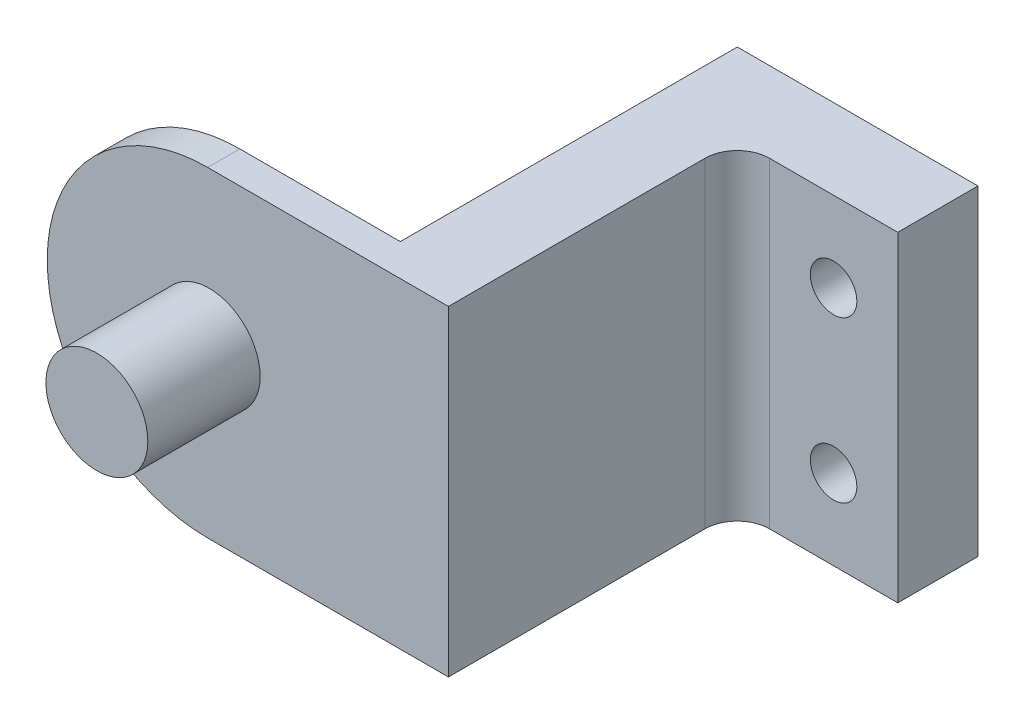
ISO-10303-21;
HEADER;
FILE_DESCRIPTION(('STEP AP214'),'2;1');
FILE_NAME('part.step','',(''),(''),'','','');
FILE_SCHEMA(('AUTOMOTIVE_DESIGN { 1 0 10303 214 1 1 1 1 }'));
ENDSEC;
DATA;
#1=APPLICATION_CONTEXT('core data for automotive mechanical design processes');
#2=APPLICATION_PROTOCOL_DEFINITION('international standard','automotive_design',2000,#1);
#3=PRODUCT_CONTEXT('',#1,'mechanical');
#4=PRODUCT('Part','Part','',(#3));
#5=PRODUCT_RELATED_PRODUCT_CATEGORY('part','',(#4));
#6=PRODUCT_DEFINITION_FORMATION('','',#4);
#7=PRODUCT_DEFINITION_CONTEXT('part definition',#1,'design');
#8=PRODUCT_DEFINITION('design','',#6,#7);
#9=PRODUCT_DEFINITION_SHAPE('','',#8);
#10=(LENGTH_UNIT() NAMED_UNIT(*) SI_UNIT(.MILLI.,.METRE.));
#11=(NAMED_UNIT(*) PLANE_ANGLE_UNIT() SI_UNIT($,.RADIAN.));
#12=(NAMED_UNIT(*) SI_UNIT($,.STERADIAN.) SOLID_ANGLE_UNIT());
#13=UNCERTAINTY_MEASURE_WITH_UNIT(LENGTH_MEASURE(1.E-05),#10,'distance_accuracy_value','');
#14=(GEOMETRIC_REPRESENTATION_CONTEXT(3) GLOBAL_UNCERTAINTY_ASSIGNED_CONTEXT((#13)) GLOBAL_UNIT_ASSIGNED_CONTEXT((#10,
#11,#12)) REPRESENTATION_CONTEXT('',''));
#15=CARTESIAN_POINT('',(0.,0.,0.));
#16=DIRECTION('',(0.,0.,1.));
#17=DIRECTION('',(1.,0.,0.));
#18=AXIS2_PLACEMENT_3D('',#15,#16,#17);
#19=CARTESIAN_POINT('',(2.5,10.,21.));
#20=DIRECTION('',(-1.,0.,0.));
#21=DIRECTION('',(0.,-1.,0.));
#22=AXIS2_PLACEMENT_3D('',#19,#20,#21);
#23=PLANE('',#22);
#24=DIRECTION('',(0.,0.,-1.));
#25=VECTOR('',#24,1.);
#26=CARTESIAN_POINT('',(2.5,-10.,21.));
#27=LINE('',#26,#25);
#28=CARTESIAN_POINT('',(2.5,-10.,23.));
#29=VERTEX_POINT('',#28);
#30=CARTESIAN_POINT('',(2.5,-10.,7.));
#31=VERTEX_POINT('',#30);
#32=EDGE_CURVE('E170',#29,#31,#27,.T.);
#33=ORIENTED_EDGE('',*,*,#32,.T.);
#34=DIRECTION('',(0.,-1.,0.));
#35=VECTOR('',#34,1.);
#36=CARTESIAN_POINT('',(2.5,10.,7.));
#37=LINE('',#36,#35);
#38=CARTESIAN_POINT('',(2.5,10.,7.));
#39=VERTEX_POINT('',#38);
#40=EDGE_CURVE('E54',#31,#39,#37,.F.);
#41=ORIENTED_EDGE('',*,*,#40,.T.);
#42=DIRECTION('',(0.,0.,-1.));
#43=VECTOR('',#42,1.);
#44=CARTESIAN_POINT('',(2.5,10.,21.));
#45=LINE('',#44,#43);
#46=CARTESIAN_POINT('',(2.5,10.,23.));
#47=VERTEX_POINT('',#46);
#48=EDGE_CURVE('E157',#47,#39,#45,.T.);
#49=ORIENTED_EDGE('',*,*,#48,.F.);
#50=DIRECTION('',(0.,1.,0.));
#51=VECTOR('',#50,1.);
#52=CARTESIAN_POINT('',(2.5,10.,23.));
#53=LINE('',#52,#51);
#54=EDGE_CURVE('E158',#29,#47,#53,.T.);
#55=ORIENTED_EDGE('',*,*,#54,.F.);
#56=EDGE_LOOP('',(#33,#41,#49,#55));
#57=FACE_BOUND('',#56,.T.);
#58=ADVANCED_FACE('F33',(#57),#23,.F.);
#59=CARTESIAN_POINT('',(-2.5,10.,21.));
#60=DIRECTION('',(0.,-1.,0.));
#61=DIRECTION('',(0.,0.,-1.));
#62=AXIS2_PLACEMENT_3D('',#59,#60,#61);
#63=PLANE('',#62);
#64=DIRECTION('',(-1.,0.,0.));
#65=VECTOR('',#64,1.);
#66=CARTESIAN_POINT('',(2.5,10.,21.));
#67=LINE('',#66,#65);
#68=CARTESIAN_POINT('',(-2.5,10.,21.));
#69=VERTEX_POINT('',#68);
#70=CARTESIAN_POINT('',(-12.5,9.99999999999999,21.));
#71=VERTEX_POINT('',#70);
#72=EDGE_CURVE('E152',#69,#71,#67,.T.);
#73=ORIENTED_EDGE('',*,*,#72,.T.);
#74=DIRECTION('',(0.,0.,-1.));
#75=VECTOR('',#74,1.);
#76=CARTESIAN_POINT('',(-12.5,10.,21.));
#77=LINE('',#76,#75);
#78=CARTESIAN_POINT('',(-12.5,9.99999999999999,23.));
#79=VERTEX_POINT('',#78);
#80=EDGE_CURVE('E185',#71,#79,#77,.F.);
#81=ORIENTED_EDGE('',*,*,#80,.T.);
#82=DIRECTION('',(-1.,0.,0.));
#83=VECTOR('',#82,1.);
#84=CARTESIAN_POINT('',(2.5,10.,23.));
#85=LINE('',#84,#83);
#86=EDGE_CURVE('E161',#47,#79,#85,.T.);
#87=ORIENTED_EDGE('',*,*,#86,.F.);
#88=ORIENTED_EDGE('',*,*,#48,.T.);
#89=CARTESIAN_POINT('',(4.5,10.,7.));
#90=DIRECTION('',(0.,-1.,0.));
#91=DIRECTION('',(0.,0.,-1.));
#92=AXIS2_PLACEMENT_3D('',#89,#90,#91);
#93=CIRCLE('',#92,2.);
#94=CARTESIAN_POINT('',(4.5,10.,5.));
#95=VERTEX_POINT('',#94);
#96=EDGE_CURVE('E11',#39,#95,#93,.T.);
#97=ORIENTED_EDGE('',*,*,#96,.T.);
#98=DIRECTION('',(-1.,0.,0.));
#99=VECTOR('',#98,1.);
#100=CARTESIAN_POINT('',(12.5,10.,5.));
#101=LINE('',#100,#99);
#102=CARTESIAN_POINT('',(12.5,10.,5.));
#103=VERTEX_POINT('',#102);
#104=EDGE_CURVE('E125',#103,#95,#101,.T.);
#105=ORIENTED_EDGE('',*,*,#104,.F.);
#106=DIRECTION('',(0.,0.,1.));
#107=VECTOR('',#106,1.);
#108=CARTESIAN_POINT('',(12.5,10.,0.));
#109=LINE('',#108,#107);
#110=CARTESIAN_POINT('',(12.5,10.,0.));
#111=VERTEX_POINT('',#110);
#112=EDGE_CURVE('E121',#111,#103,#109,.T.);
#113=ORIENTED_EDGE('',*,*,#112,.F.);
#114=DIRECTION('',(-1.,0.,0.));
#115=VECTOR('',#114,1.);
#116=CARTESIAN_POINT('',(-2.5,10.,0.));
#117=LINE('',#116,#115);
#118=CARTESIAN_POINT('',(-2.5,10.,0.));
#119=VERTEX_POINT('',#118);
#120=EDGE_CURVE('E109',#111,#119,#117,.T.);
#121=ORIENTED_EDGE('',*,*,#120,.T.);
#122=DIRECTION('',(0.,0.,-1.));
#123=VECTOR('',#122,1.);
#124=CARTESIAN_POINT('',(-2.5,10.,21.));
#125=LINE('',#124,#123);
#126=EDGE_CURVE('E179',#69,#119,#125,.T.);
#127=ORIENTED_EDGE('',*,*,#126,.F.);
#128=EDGE_LOOP('',(#73,#81,#87,#88,#97,#105,#113,#121,#127));
#129=FACE_BOUND('',#128,.T.);
#130=ADVANCED_FACE('F123',(#129),#63,.F.);
#131=CARTESIAN_POINT('',(-2.5,10.,21.));
#132=DIRECTION('',(1.,0.,0.));
#133=DIRECTION('',(0.,1.,0.));
#134=AXIS2_PLACEMENT_3D('',#131,#132,#133);
#135=PLANE('',#134);
#136=DIRECTION('',(0.,-1.,0.));
#137=VECTOR('',#136,1.);
#138=CARTESIAN_POINT('',(-2.5,10.,0.));
#139=LINE('',#138,#137);
#140=CARTESIAN_POINT('',(-2.5,-10.,0.));
#141=VERTEX_POINT('',#140);
#142=EDGE_CURVE('E115',#119,#141,#139,.T.);
#143=ORIENTED_EDGE('',*,*,#142,.T.);
#144=DIRECTION('',(0.,0.,-1.));
#145=VECTOR('',#144,1.);
#146=CARTESIAN_POINT('',(-2.5,-10.,21.));
#147=LINE('',#146,#145);
#148=CARTESIAN_POINT('',(-2.5,-10.,21.));
#149=VERTEX_POINT('',#148);
#150=EDGE_CURVE('E176',#149,#141,#147,.T.);
#151=ORIENTED_EDGE('',*,*,#150,.F.);
#152=DIRECTION('',(0.,-1.,0.));
#153=VECTOR('',#152,1.);
#154=CARTESIAN_POINT('',(-2.5,10.,21.));
#155=LINE('',#154,#153);
#156=EDGE_CURVE('E168',#69,#149,#155,.T.);
#157=ORIENTED_EDGE('',*,*,#156,.F.);
#158=ORIENTED_EDGE('',*,*,#126,.T.);
#159=EDGE_LOOP('',(#143,#151,#157,#158));
#160=FACE_BOUND('',#159,.T.);
#161=ADVANCED_FACE('F211',(#160),#135,.F.);
#162=CARTESIAN_POINT('',(-2.5,-10.,21.));
#163=DIRECTION('',(0.,1.,0.));
#164=DIRECTION('',(0.,0.,1.));
#165=AXIS2_PLACEMENT_3D('',#162,#163,#164);
#166=PLANE('',#165);
#167=DIRECTION('',(1.,0.,0.));
#168=VECTOR('',#167,1.);
#169=CARTESIAN_POINT('',(2.5,-10.,23.));
#170=LINE('',#169,#168);
#171=CARTESIAN_POINT('',(-12.5,-10.,23.));
#172=VERTEX_POINT('',#171);
#173=EDGE_CURVE('E118',#172,#29,#170,.T.);
#174=ORIENTED_EDGE('',*,*,#173,.F.);
#175=DIRECTION('',(0.,0.,-1.));
#176=VECTOR('',#175,1.);
#177=CARTESIAN_POINT('',(-12.5,-10.,21.));
#178=LINE('',#177,#176);
#179=CARTESIAN_POINT('',(-12.5,-10.,21.));
#180=VERTEX_POINT('',#179);
#181=EDGE_CURVE('E192',#172,#180,#178,.T.);
#182=ORIENTED_EDGE('',*,*,#181,.T.);
#183=DIRECTION('',(1.,0.,0.));
#184=VECTOR('',#183,1.);
#185=CARTESIAN_POINT('',(2.5,-10.,21.));
#186=LINE('',#185,#184);
#187=EDGE_CURVE('E162',#180,#149,#186,.T.);
#188=ORIENTED_EDGE('',*,*,#187,.T.);
#189=ORIENTED_EDGE('',*,*,#150,.T.);
#190=DIRECTION('',(1.,0.,0.));
#191=VECTOR('',#190,1.);
#192=CARTESIAN_POINT('',(-2.5,-10.,0.));
#193=LINE('',#192,#191);
#194=CARTESIAN_POINT('',(12.5,-10.,0.));
#195=VERTEX_POINT('',#194);
#196=EDGE_CURVE('E171',#141,#195,#193,.T.);
#197=ORIENTED_EDGE('',*,*,#196,.T.);
#198=DIRECTION('',(0.,0.,-1.));
#199=VECTOR('',#198,1.);
#200=CARTESIAN_POINT('',(12.5,-10.,0.));
#201=LINE('',#200,#199);
#202=CARTESIAN_POINT('',(12.5,-10.,5.));
#203=VERTEX_POINT('',#202);
#204=EDGE_CURVE('E133',#203,#195,#201,.T.);
#205=ORIENTED_EDGE('',*,*,#204,.F.);
#206=DIRECTION('',(-1.,0.,0.));
#207=VECTOR('',#206,1.);
#208=CARTESIAN_POINT('',(12.5,-10.,5.));
#209=LINE('',#208,#207);
#210=CARTESIAN_POINT('',(4.5,-10.,5.));
#211=VERTEX_POINT('',#210);
#212=EDGE_CURVE('E145',#203,#211,#209,.T.);
#213=ORIENTED_EDGE('',*,*,#212,.T.);
#214=CARTESIAN_POINT('',(4.5,-10.,7.));
#215=DIRECTION('',(0.,1.,0.));
#216=DIRECTION('',(0.,0.,1.));
#217=AXIS2_PLACEMENT_3D('',#214,#215,#216);
#218=CIRCLE('',#217,2.);
#219=EDGE_CURVE('E41',#211,#31,#218,.T.);
#220=ORIENTED_EDGE('',*,*,#219,.T.);
#221=ORIENTED_EDGE('',*,*,#32,.F.);
#222=EDGE_LOOP('',(#174,#182,#188,#189,#197,#205,#213,#220,#221));
#223=FACE_BOUND('',#222,.T.);
#224=ADVANCED_FACE('F206',(#223),#166,.F.);
#225=CARTESIAN_POINT('',(0.,0.,0.));
#226=DIRECTION('',(0.,0.,1.));
#227=DIRECTION('',(1.,0.,0.));
#228=AXIS2_PLACEMENT_3D('',#225,#226,#227);
#229=PLANE('',#228);
#230=CARTESIAN_POINT('',(8.5,5.,0.));
#231=DIRECTION('',(0.,0.,1.));
#232=DIRECTION('',(1.,0.,0.));
#233=AXIS2_PLACEMENT_3D('',#230,#231,#232);
#234=CIRCLE('',#233,1.45);
#235=CARTESIAN_POINT('',(9.95,5.,0.));
#236=VERTEX_POINT('',#235);
#237=EDGE_CURVE('E134',#236,#236,#234,.F.);
#238=ORIENTED_EDGE('',*,*,#237,.F.);
#239=EDGE_LOOP('',(#238));
#240=FACE_BOUND('',#239,.T.);
#241=CARTESIAN_POINT('',(8.5,-5.,0.));
#242=DIRECTION('',(0.,0.,1.));
#243=DIRECTION('',(1.,0.,0.));
#244=AXIS2_PLACEMENT_3D('',#241,#242,#243);
#245=CIRCLE('',#244,1.45);
#246=CARTESIAN_POINT('',(9.95,-5.,0.));
#247=VERTEX_POINT('',#246);
#248=EDGE_CURVE('E140',#247,#247,#245,.F.);
#249=ORIENTED_EDGE('',*,*,#248,.F.);
#250=EDGE_LOOP('',(#249));
#251=FACE_BOUND('',#250,.T.);
#252=ORIENTED_EDGE('',*,*,#120,.F.);
#253=DIRECTION('',(0.,1.,0.));
#254=VECTOR('',#253,1.);
#255=CARTESIAN_POINT('',(12.5,10.,0.));
#256=LINE('',#255,#254);
#257=EDGE_CURVE('E114',#195,#111,#256,.T.);
#258=ORIENTED_EDGE('',*,*,#257,.F.);
#259=ORIENTED_EDGE('',*,*,#196,.F.);
#260=ORIENTED_EDGE('',*,*,#142,.F.);
#261=EDGE_LOOP('',(#252,#258,#259,#260));
#262=FACE_BOUND('',#261,.T.);
#263=ADVANCED_FACE('F111',(#240,#251,#262),#229,.F.);
#264=CARTESIAN_POINT('',(0.,0.,23.));
#265=DIRECTION('',(0.,0.,-1.));
#266=DIRECTION('',(-1.,0.,0.));
#267=AXIS2_PLACEMENT_3D('',#264,#265,#266);
#268=PLANE('',#267);
#269=CARTESIAN_POINT('',(-12.41,0.349999999999998,23.));
#270=DIRECTION('',(0.,0.,1.));
#271=DIRECTION('',(1.,0.,0.));
#272=AXIS2_PLACEMENT_3D('',#269,#270,#271);
#273=CIRCLE('',#272,3.175);
#274=CARTESIAN_POINT('',(-9.235,0.349999999999998,23.));
#275=VERTEX_POINT('',#274);
#276=EDGE_CURVE('E153',#275,#275,#273,.T.);
#277=ORIENTED_EDGE('',*,*,#276,.F.);
#278=EDGE_LOOP('',(#277));
#279=FACE_BOUND('',#278,.T.);
#280=ORIENTED_EDGE('',*,*,#86,.T.);
#281=CARTESIAN_POINT('',(-12.5,0.,23.));
#282=DIRECTION('',(0.,0.,-1.));
#283=DIRECTION('',(-1.,0.,0.));
#284=AXIS2_PLACEMENT_3D('',#281,#282,#283);
#285=CIRCLE('',#284,10.);
#286=CARTESIAN_POINT('',(-22.5,0.,23.));
#287=VERTEX_POINT('',#286);
#288=EDGE_CURVE('E190',#79,#287,#285,.F.);
#289=ORIENTED_EDGE('',*,*,#288,.T.);
#290=CARTESIAN_POINT('',(-12.5,0.,23.));
#291=DIRECTION('',(0.,0.,-1.));
#292=DIRECTION('',(-1.,0.,0.));
#293=AXIS2_PLACEMENT_3D('',#290,#291,#292);
#294=CIRCLE('',#293,10.);
#295=EDGE_CURVE('E188',#287,#172,#294,.F.);
#296=ORIENTED_EDGE('',*,*,#295,.T.);
#297=ORIENTED_EDGE('',*,*,#173,.T.);
#298=ORIENTED_EDGE('',*,*,#54,.T.);
#299=EDGE_LOOP('',(#280,#289,#296,#297,#298));
#300=FACE_BOUND('',#299,.T.);
#301=ADVANCED_FACE('F224',(#279,#300),#268,.F.);
#302=CARTESIAN_POINT('',(0.,0.,21.));
#303=DIRECTION('',(0.,0.,-1.));
#304=DIRECTION('',(-1.,0.,0.));
#305=AXIS2_PLACEMENT_3D('',#302,#303,#304);
#306=PLANE('',#305);
#307=CARTESIAN_POINT('',(-12.5,0.,21.));
#308=DIRECTION('',(0.,0.,-1.));
#309=DIRECTION('',(-1.,0.,0.));
#310=AXIS2_PLACEMENT_3D('',#307,#308,#309);
#311=CIRCLE('',#310,10.);
#312=CARTESIAN_POINT('',(-22.5,0.,21.));
#313=VERTEX_POINT('',#312);
#314=EDGE_CURVE('E156',#180,#313,#311,.T.);
#315=ORIENTED_EDGE('',*,*,#314,.T.);
#316=CARTESIAN_POINT('',(-12.5,0.,21.));
#317=DIRECTION('',(0.,0.,-1.));
#318=DIRECTION('',(-1.,0.,0.));
#319=AXIS2_PLACEMENT_3D('',#316,#317,#318);
#320=CIRCLE('',#319,10.);
#321=EDGE_CURVE('E183',#313,#71,#320,.T.);
#322=ORIENTED_EDGE('',*,*,#321,.T.);
#323=ORIENTED_EDGE('',*,*,#72,.F.);
#324=ORIENTED_EDGE('',*,*,#156,.T.);
#325=ORIENTED_EDGE('',*,*,#187,.F.);
#326=EDGE_LOOP('',(#315,#322,#323,#324,#325));
#327=FACE_BOUND('',#326,.T.);
#328=ADVANCED_FACE('F214',(#327),#306,.T.);
#329=CARTESIAN_POINT('',(-12.41,0.349999999999998,30.));
#330=DIRECTION('',(0.,0.,-1.));
#331=DIRECTION('',(-1.,0.,0.));
#332=AXIS2_PLACEMENT_3D('',#329,#330,#331);
#333=CYLINDRICAL_SURFACE('',#332,3.175);
#334=CARTESIAN_POINT('',(-12.41,0.349999999999998,30.));
#335=DIRECTION('',(0.,0.,1.));
#336=DIRECTION('',(1.,0.,0.));
#337=AXIS2_PLACEMENT_3D('',#334,#335,#336);
#338=CIRCLE('',#337,3.175);
#339=CARTESIAN_POINT('',(-9.235,0.349999999999998,30.));
#340=VERTEX_POINT('',#339);
#341=EDGE_CURVE('E149',#340,#340,#338,.T.);
#342=ORIENTED_EDGE('',*,*,#341,.F.);
#343=EDGE_LOOP('',(#342));
#344=FACE_BOUND('',#343,.T.);
#345=ORIENTED_EDGE('',*,*,#276,.T.);
#346=EDGE_LOOP('',(#345));
#347=FACE_BOUND('',#346,.T.);
#348=ADVANCED_FACE('F253',(#344,#347),#333,.T.);
#349=CARTESIAN_POINT('',(-12.41,0.349999999999998,30.));
#350=DIRECTION('',(0.,0.,1.));
#351=DIRECTION('',(1.,0.,0.));
#352=AXIS2_PLACEMENT_3D('',#349,#350,#351);
#353=PLANE('',#352);
#354=ORIENTED_EDGE('',*,*,#341,.T.);
#355=EDGE_LOOP('',(#354));
#356=FACE_BOUND('',#355,.T.);
#357=ADVANCED_FACE('F249',(#356),#353,.T.);
#358=CARTESIAN_POINT('',(-12.5,0.,21.));
#359=DIRECTION('',(0.,0.,-1.));
#360=DIRECTION('',(-1.,0.,0.));
#361=AXIS2_PLACEMENT_3D('',#358,#359,#360);
#362=CYLINDRICAL_SURFACE('',#361,10.);
#363=ORIENTED_EDGE('',*,*,#181,.F.);
#364=ORIENTED_EDGE('',*,*,#295,.F.);
#365=DIRECTION('',(0.,0.,-1.));
#366=VECTOR('',#365,1.);
#367=CARTESIAN_POINT('',(-22.5,0.,23.));
#368=LINE('',#367,#366);
#369=EDGE_CURVE('E148',#313,#287,#368,.F.);
#370=ORIENTED_EDGE('',*,*,#369,.F.);
#371=ORIENTED_EDGE('',*,*,#314,.F.);
#372=EDGE_LOOP('',(#363,#364,#370,#371));
#373=FACE_BOUND('',#372,.T.);
#374=ADVANCED_FACE('F227',(#373),#362,.T.);
#375=CARTESIAN_POINT('',(-12.5,0.,23.));
#376=DIRECTION('',(0.,0.,-1.));
#377=DIRECTION('',(-1.,0.,0.));
#378=AXIS2_PLACEMENT_3D('',#375,#376,#377);
#379=CYLINDRICAL_SURFACE('',#378,10.);
#380=ORIENTED_EDGE('',*,*,#288,.F.);
#381=ORIENTED_EDGE('',*,*,#80,.F.);
#382=ORIENTED_EDGE('',*,*,#321,.F.);
#383=ORIENTED_EDGE('',*,*,#369,.T.);
#384=EDGE_LOOP('',(#380,#381,#382,#383));
#385=FACE_BOUND('',#384,.T.);
#386=ADVANCED_FACE('F220',(#385),#379,.T.);
#387=CARTESIAN_POINT('',(12.5,10.,5.));
#388=DIRECTION('',(0.,0.,-1.));
#389=DIRECTION('',(0.,1.,0.));
#390=AXIS2_PLACEMENT_3D('',#387,#388,#389);
#391=PLANE('',#390);
#392=CARTESIAN_POINT('',(8.5,5.,5.));
#393=DIRECTION('',(0.,0.,1.));
#394=DIRECTION('',(1.,0.,0.));
#395=AXIS2_PLACEMENT_3D('',#392,#393,#394);
#396=CIRCLE('',#395,1.45);
#397=CARTESIAN_POINT('',(9.95,5.,5.));
#398=VERTEX_POINT('',#397);
#399=EDGE_CURVE('E137',#398,#398,#396,.T.);
#400=ORIENTED_EDGE('',*,*,#399,.F.);
#401=EDGE_LOOP('',(#400));
#402=FACE_BOUND('',#401,.T.);
#403=CARTESIAN_POINT('',(8.5,-5.,5.));
#404=DIRECTION('',(0.,0.,1.));
#405=DIRECTION('',(1.,0.,0.));
#406=AXIS2_PLACEMENT_3D('',#403,#404,#405);
#407=CIRCLE('',#406,1.45);
#408=CARTESIAN_POINT('',(9.95,-5.,5.));
#409=VERTEX_POINT('',#408);
#410=EDGE_CURVE('E379',#409,#409,#407,.T.);
#411=ORIENTED_EDGE('',*,*,#410,.F.);
#412=EDGE_LOOP('',(#411));
#413=FACE_BOUND('',#412,.T.);
#414=ORIENTED_EDGE('',*,*,#104,.T.);
#415=DIRECTION('',(0.,-1.,0.));
#416=VECTOR('',#415,1.);
#417=CARTESIAN_POINT('',(4.5,-10.,5.));
#418=LINE('',#417,#416);
#419=EDGE_CURVE('E194',#95,#211,#418,.T.);
#420=ORIENTED_EDGE('',*,*,#419,.T.);
#421=ORIENTED_EDGE('',*,*,#212,.F.);
#422=DIRECTION('',(0.,-1.,0.));
#423=VECTOR('',#422,1.);
#424=CARTESIAN_POINT('',(12.5,10.,5.));
#425=LINE('',#424,#423);
#426=EDGE_CURVE('E128',#103,#203,#425,.T.);
#427=ORIENTED_EDGE('',*,*,#426,.F.);
#428=EDGE_LOOP('',(#414,#420,#421,#427));
#429=FACE_BOUND('',#428,.T.);
#430=ADVANCED_FACE('F202',(#402,#413,#429),#391,.F.);
#431=CARTESIAN_POINT('',(12.5,0.,0.));
#432=DIRECTION('',(-1.,0.,0.));
#433=DIRECTION('',(0.,-1.,0.));
#434=AXIS2_PLACEMENT_3D('',#431,#432,#433);
#435=PLANE('',#434);
#436=ORIENTED_EDGE('',*,*,#257,.T.);
#437=ORIENTED_EDGE('',*,*,#112,.T.);
#438=ORIENTED_EDGE('',*,*,#426,.T.);
#439=ORIENTED_EDGE('',*,*,#204,.T.);
#440=EDGE_LOOP('',(#436,#437,#438,#439));
#441=FACE_BOUND('',#440,.T.);
#442=ADVANCED_FACE('F131',(#441),#435,.F.);
#443=CARTESIAN_POINT('',(4.5,10.,7.));
#444=DIRECTION('',(0.,1.,0.));
#445=DIRECTION('',(-1.,0.,0.));
#446=AXIS2_PLACEMENT_3D('',#443,#444,#445);
#447=CYLINDRICAL_SURFACE('',#446,2.);
#448=ORIENTED_EDGE('',*,*,#96,.F.);
#449=ORIENTED_EDGE('',*,*,#40,.F.);
#450=ORIENTED_EDGE('',*,*,#219,.F.);
#451=ORIENTED_EDGE('',*,*,#419,.F.);
#452=EDGE_LOOP('',(#448,#449,#450,#451));
#453=FACE_BOUND('',#452,.T.);
#454=ADVANCED_FACE('F35',(#453),#447,.F.);
#455=CARTESIAN_POINT('',(8.5,-5.,-0.00100000000000013));
#456=DIRECTION('',(0.,0.,1.));
#457=DIRECTION('',(1.,0.,0.));
#458=AXIS2_PLACEMENT_3D('',#455,#456,#457);
#459=CYLINDRICAL_SURFACE('',#458,1.45);
#460=ORIENTED_EDGE('',*,*,#410,.T.);
#461=EDGE_LOOP('',(#460));
#462=FACE_BOUND('',#461,.T.);
#463=ORIENTED_EDGE('',*,*,#248,.T.);
#464=EDGE_LOOP('',(#463));
#465=FACE_BOUND('',#464,.T.);
#466=ADVANCED_FACE('F230',(#462,#465),#459,.F.);
#467=CARTESIAN_POINT('',(8.5,5.,-0.00100000000000013));
#468=DIRECTION('',(0.,0.,1.));
#469=DIRECTION('',(1.,0.,0.));
#470=AXIS2_PLACEMENT_3D('',#467,#468,#469);
#471=CYLINDRICAL_SURFACE('',#470,1.45);
#472=ORIENTED_EDGE('',*,*,#399,.T.);
#473=EDGE_LOOP('',(#472));
#474=FACE_BOUND('',#473,.T.);
#475=ORIENTED_EDGE('',*,*,#237,.T.);
#476=EDGE_LOOP('',(#475));
#477=FACE_BOUND('',#476,.T.);
#478=ADVANCED_FACE('F235',(#474,#477),#471,.F.);
#479=CLOSED_SHELL('',(#58,#130,#161,#224,#263,#301,#328,#348,#357,#374,#386,#430,#442,#454,#466,#478));
#480=MANIFOLD_SOLID_BREP('B2',#479);
#481=ADVANCED_BREP_SHAPE_REPRESENTATION('',(#18,#480),#14);
#482=SHAPE_DEFINITION_REPRESENTATION(#9,#481);
ENDSEC;
END-ISO-10303-21;
